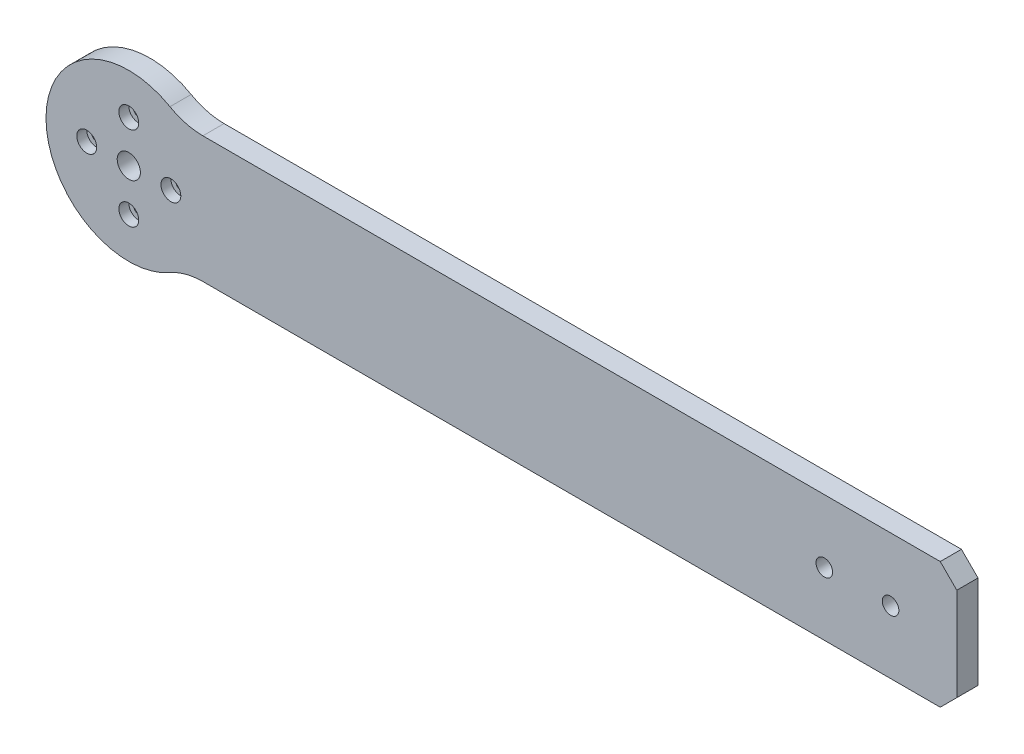
ISO-10303-21;
HEADER;
FILE_DESCRIPTION(('STEP AP214'),'2;1');
FILE_NAME('part.step','',(''),(''),'','','');
FILE_SCHEMA(('AUTOMOTIVE_DESIGN { 1 0 10303 214 1 1 1 1 }'));
ENDSEC;
DATA;
#1=APPLICATION_CONTEXT('core data for automotive mechanical design processes');
#2=APPLICATION_PROTOCOL_DEFINITION('international standard','automotive_design',2000,#1);
#3=PRODUCT_CONTEXT('',#1,'mechanical');
#4=PRODUCT('Part','Part','',(#3));
#5=PRODUCT_RELATED_PRODUCT_CATEGORY('part','',(#4));
#6=PRODUCT_DEFINITION_FORMATION('','',#4);
#7=PRODUCT_DEFINITION_CONTEXT('part definition',#1,'design');
#8=PRODUCT_DEFINITION('design','',#6,#7);
#9=PRODUCT_DEFINITION_SHAPE('','',#8);
#10=(LENGTH_UNIT() NAMED_UNIT(*) SI_UNIT(.MILLI.,.METRE.));
#11=(NAMED_UNIT(*) PLANE_ANGLE_UNIT() SI_UNIT($,.RADIAN.));
#12=(NAMED_UNIT(*) SI_UNIT($,.STERADIAN.) SOLID_ANGLE_UNIT());
#13=UNCERTAINTY_MEASURE_WITH_UNIT(LENGTH_MEASURE(1.E-05),#10,'distance_accuracy_value','');
#14=(GEOMETRIC_REPRESENTATION_CONTEXT(3) GLOBAL_UNCERTAINTY_ASSIGNED_CONTEXT((#13)) GLOBAL_UNIT_ASSIGNED_CONTEXT((#10,
#11,#12)) REPRESENTATION_CONTEXT('',''));
#15=CARTESIAN_POINT('',(0.,0.,0.));
#16=DIRECTION('',(0.,0.,1.));
#17=DIRECTION('',(1.,0.,0.));
#18=AXIS2_PLACEMENT_3D('',#15,#16,#17);
#19=CARTESIAN_POINT('',(0.,12.7,6.4));
#20=DIRECTION('',(0.,0.,-1.));
#21=DIRECTION('',(-1.,0.,0.));
#22=AXIS2_PLACEMENT_3D('',#19,#20,#21);
#23=CYLINDRICAL_SURFACE('',#22,1.5);
#24=CARTESIAN_POINT('',(0.,12.7,0.));
#25=DIRECTION('',(0.,0.,1.));
#26=DIRECTION('',(1.,0.,0.));
#27=AXIS2_PLACEMENT_3D('',#24,#25,#26);
#28=CIRCLE('',#27,1.5);
#29=CARTESIAN_POINT('',(1.5,12.7,0.));
#30=VERTEX_POINT('',#29);
#31=EDGE_CURVE('E362',#30,#30,#28,.T.);
#32=ORIENTED_EDGE('',*,*,#31,.F.);
#33=EDGE_LOOP('',(#32));
#34=FACE_BOUND('',#33,.T.);
#35=CARTESIAN_POINT('',(0.,12.7,3.4));
#36=DIRECTION('',(0.,0.,1.));
#37=DIRECTION('',(1.,0.,0.));
#38=AXIS2_PLACEMENT_3D('',#35,#36,#37);
#39=CIRCLE('',#38,1.5);
#40=CARTESIAN_POINT('',(1.5,12.7,3.4));
#41=VERTEX_POINT('',#40);
#42=EDGE_CURVE('E173',#41,#41,#39,.T.);
#43=ORIENTED_EDGE('',*,*,#42,.T.);
#44=EDGE_LOOP('',(#43));
#45=FACE_BOUND('',#44,.T.);
#46=ADVANCED_FACE('F53',(#34,#45),#23,.F.);
#47=CARTESIAN_POINT('',(12.7,0.,6.4));
#48=DIRECTION('',(0.,0.,-1.));
#49=DIRECTION('',(-1.,0.,0.));
#50=AXIS2_PLACEMENT_3D('',#47,#48,#49);
#51=CYLINDRICAL_SURFACE('',#50,1.5);
#52=CARTESIAN_POINT('',(12.7,0.,0.));
#53=DIRECTION('',(0.,0.,1.));
#54=DIRECTION('',(1.,0.,0.));
#55=AXIS2_PLACEMENT_3D('',#52,#53,#54);
#56=CIRCLE('',#55,1.5);
#57=CARTESIAN_POINT('',(14.2,0.,0.));
#58=VERTEX_POINT('',#57);
#59=EDGE_CURVE('E358',#58,#58,#56,.T.);
#60=ORIENTED_EDGE('',*,*,#59,.F.);
#61=EDGE_LOOP('',(#60));
#62=FACE_BOUND('',#61,.T.);
#63=CARTESIAN_POINT('',(12.7,0.,3.4));
#64=DIRECTION('',(0.,0.,1.));
#65=DIRECTION('',(1.,0.,0.));
#66=AXIS2_PLACEMENT_3D('',#63,#64,#65);
#67=CIRCLE('',#66,1.5);
#68=CARTESIAN_POINT('',(14.2,0.,3.4));
#69=VERTEX_POINT('',#68);
#70=EDGE_CURVE('E169',#69,#69,#67,.T.);
#71=ORIENTED_EDGE('',*,*,#70,.T.);
#72=EDGE_LOOP('',(#71));
#73=FACE_BOUND('',#72,.T.);
#74=ADVANCED_FACE('F233',(#62,#73),#51,.F.);
#75=CARTESIAN_POINT('',(0.,-12.7,6.4));
#76=DIRECTION('',(0.,0.,-1.));
#77=DIRECTION('',(-1.,0.,0.));
#78=AXIS2_PLACEMENT_3D('',#75,#76,#77);
#79=CYLINDRICAL_SURFACE('',#78,1.5);
#80=CARTESIAN_POINT('',(0.,-12.7,0.));
#81=DIRECTION('',(0.,0.,1.));
#82=DIRECTION('',(1.,0.,0.));
#83=AXIS2_PLACEMENT_3D('',#80,#81,#82);
#84=CIRCLE('',#83,1.5);
#85=CARTESIAN_POINT('',(1.49999999999991,-12.7,0.));
#86=VERTEX_POINT('',#85);
#87=EDGE_CURVE('E325',#86,#86,#84,.T.);
#88=ORIENTED_EDGE('',*,*,#87,.F.);
#89=EDGE_LOOP('',(#88));
#90=FACE_BOUND('',#89,.T.);
#91=CARTESIAN_POINT('',(0.,-12.7,3.4));
#92=DIRECTION('',(0.,0.,1.));
#93=DIRECTION('',(1.,0.,0.));
#94=AXIS2_PLACEMENT_3D('',#91,#92,#93);
#95=CIRCLE('',#94,1.5);
#96=CARTESIAN_POINT('',(1.49999999999991,-12.7,3.4));
#97=VERTEX_POINT('',#96);
#98=EDGE_CURVE('E164',#97,#97,#95,.T.);
#99=ORIENTED_EDGE('',*,*,#98,.T.);
#100=EDGE_LOOP('',(#99));
#101=FACE_BOUND('',#100,.T.);
#102=ADVANCED_FACE('F239',(#90,#101),#79,.F.);
#103=CARTESIAN_POINT('',(-12.7,0.,6.4));
#104=DIRECTION('',(0.,0.,-1.));
#105=DIRECTION('',(-1.,0.,0.));
#106=AXIS2_PLACEMENT_3D('',#103,#104,#105);
#107=CYLINDRICAL_SURFACE('',#106,1.49999999999996);
#108=CARTESIAN_POINT('',(-12.7,0.,0.));
#109=DIRECTION('',(0.,0.,1.));
#110=DIRECTION('',(1.,0.,0.));
#111=AXIS2_PLACEMENT_3D('',#108,#109,#110);
#112=CIRCLE('',#111,1.49999999999996);
#113=CARTESIAN_POINT('',(-11.2,0.,0.));
#114=VERTEX_POINT('',#113);
#115=EDGE_CURVE('E176',#114,#114,#112,.T.);
#116=ORIENTED_EDGE('',*,*,#115,.F.);
#117=EDGE_LOOP('',(#116));
#118=FACE_BOUND('',#117,.T.);
#119=CARTESIAN_POINT('',(-12.7,0.,3.4));
#120=DIRECTION('',(0.,0.,1.));
#121=DIRECTION('',(1.,0.,0.));
#122=AXIS2_PLACEMENT_3D('',#119,#120,#121);
#123=CIRCLE('',#122,1.49999999999996);
#124=CARTESIAN_POINT('',(-11.2,0.,3.4));
#125=VERTEX_POINT('',#124);
#126=EDGE_CURVE('E160',#125,#125,#123,.T.);
#127=ORIENTED_EDGE('',*,*,#126,.T.);
#128=EDGE_LOOP('',(#127));
#129=FACE_BOUND('',#128,.T.);
#130=ADVANCED_FACE('F261',(#118,#129),#107,.F.);
#131=CARTESIAN_POINT('',(0.,0.,6.4));
#132=DIRECTION('',(0.,0.,1.));
#133=DIRECTION('',(1.,0.,0.));
#134=AXIS2_PLACEMENT_3D('',#131,#132,#133);
#135=PLANE('',#134);
#136=CARTESIAN_POINT('',(0.,12.7,6.4));
#137=DIRECTION('',(0.,0.,1.));
#138=DIRECTION('',(1.,0.,0.));
#139=AXIS2_PLACEMENT_3D('',#136,#137,#138);
#140=CIRCLE('',#139,3.);
#141=CARTESIAN_POINT('',(3.,12.7,6.4));
#142=VERTEX_POINT('',#141);
#143=EDGE_CURVE('E406',#142,#142,#140,.T.);
#144=ORIENTED_EDGE('',*,*,#143,.F.);
#145=EDGE_LOOP('',(#144));
#146=FACE_BOUND('',#145,.T.);
#147=CARTESIAN_POINT('',(12.7,0.,6.4));
#148=DIRECTION('',(0.,0.,1.));
#149=DIRECTION('',(1.,0.,0.));
#150=AXIS2_PLACEMENT_3D('',#147,#148,#149);
#151=CIRCLE('',#150,3.);
#152=CARTESIAN_POINT('',(15.7,0.,6.4));
#153=VERTEX_POINT('',#152);
#154=EDGE_CURVE('E332',#153,#153,#151,.T.);
#155=ORIENTED_EDGE('',*,*,#154,.F.);
#156=EDGE_LOOP('',(#155));
#157=FACE_BOUND('',#156,.T.);
#158=CARTESIAN_POINT('',(0.,-12.7,6.4));
#159=DIRECTION('',(0.,0.,1.));
#160=DIRECTION('',(1.,0.,0.));
#161=AXIS2_PLACEMENT_3D('',#158,#159,#160);
#162=CIRCLE('',#161,3.);
#163=CARTESIAN_POINT('',(2.99999999999996,-12.7,6.4));
#164=VERTEX_POINT('',#163);
#165=EDGE_CURVE('E333',#164,#164,#162,.T.);
#166=ORIENTED_EDGE('',*,*,#165,.F.);
#167=EDGE_LOOP('',(#166));
#168=FACE_BOUND('',#167,.T.);
#169=CARTESIAN_POINT('',(-12.7,0.,6.4));
#170=DIRECTION('',(0.,0.,1.));
#171=DIRECTION('',(1.,0.,0.));
#172=AXIS2_PLACEMENT_3D('',#169,#170,#171);
#173=CIRCLE('',#172,3.);
#174=CARTESIAN_POINT('',(-9.70000000000004,0.,6.4));
#175=VERTEX_POINT('',#174);
#176=EDGE_CURVE('E350',#175,#175,#173,.T.);
#177=ORIENTED_EDGE('',*,*,#176,.F.);
#178=EDGE_LOOP('',(#177));
#179=FACE_BOUND('',#178,.T.);
#180=CARTESIAN_POINT('',(230.,0.,6.4));
#181=DIRECTION('',(0.,0.,1.));
#182=DIRECTION('',(1.,0.,0.));
#183=AXIS2_PLACEMENT_3D('',#180,#181,#182);
#184=CIRCLE('',#183,2.5);
#185=CARTESIAN_POINT('',(232.5,0.,6.4));
#186=VERTEX_POINT('',#185);
#187=EDGE_CURVE('E374',#186,#186,#184,.T.);
#188=ORIENTED_EDGE('',*,*,#187,.F.);
#189=EDGE_LOOP('',(#188));
#190=FACE_BOUND('',#189,.T.);
#191=DIRECTION('',(1.,0.,0.));
#192=VECTOR('',#191,1.);
#193=CARTESIAN_POINT('',(250.,-19.05,6.4));
#194=LINE('',#193,#192);
#195=CARTESIAN_POINT('',(22.3628598350032,-19.05,6.4));
#196=VERTEX_POINT('',#195);
#197=CARTESIAN_POINT('',(245.,-19.05,6.4));
#198=VERTEX_POINT('',#197);
#199=EDGE_CURVE('E138',#196,#198,#194,.T.);
#200=ORIENTED_EDGE('',*,*,#199,.T.);
#201=DIRECTION('',(-0.707106781186548,-0.707106781186548,0.));
#202=VECTOR('',#201,1.);
#203=CARTESIAN_POINT('',(132.025,-132.025,6.4));
#204=LINE('',#203,#202);
#205=CARTESIAN_POINT('',(250.,-14.05,6.4));
#206=VERTEX_POINT('',#205);
#207=EDGE_CURVE('E62',#198,#206,#204,.F.);
#208=ORIENTED_EDGE('',*,*,#207,.T.);
#209=DIRECTION('',(0.,1.,0.));
#210=VECTOR('',#209,1.);
#211=CARTESIAN_POINT('',(250.,19.05,6.4));
#212=LINE('',#211,#210);
#213=CARTESIAN_POINT('',(250.,14.05,6.4));
#214=VERTEX_POINT('',#213);
#215=EDGE_CURVE('E147',#206,#214,#212,.T.);
#216=ORIENTED_EDGE('',*,*,#215,.T.);
#217=DIRECTION('',(0.707106781186546,-0.707106781186549,0.));
#218=VECTOR('',#217,1.);
#219=CARTESIAN_POINT('',(132.025000000001,132.025,6.4));
#220=LINE('',#219,#218);
#221=CARTESIAN_POINT('',(245.,19.05,6.4));
#222=VERTEX_POINT('',#221);
#223=EDGE_CURVE('E69',#214,#222,#220,.F.);
#224=ORIENTED_EDGE('',*,*,#223,.T.);
#225=DIRECTION('',(-1.,0.,0.));
#226=VECTOR('',#225,1.);
#227=CARTESIAN_POINT('',(250.,19.05,6.4));
#228=LINE('',#227,#226);
#229=CARTESIAN_POINT('',(22.3628598350032,19.05,6.4));
#230=VERTEX_POINT('',#229);
#231=EDGE_CURVE('E153',#222,#230,#228,.T.);
#232=ORIENTED_EDGE('',*,*,#231,.T.);
#233=CARTESIAN_POINT('',(22.3628598350032,39.05,6.4));
#234=DIRECTION('',(0.,0.,1.));
#235=DIRECTION('',(1.,0.,0.));
#236=AXIS2_PLACEMENT_3D('',#233,#234,#235);
#237=CIRCLE('',#236,20.);
#238=CARTESIAN_POINT('',(12.4238110194462,21.6944444444445,6.4));
#239=VERTEX_POINT('',#238);
#240=EDGE_CURVE('E192',#230,#239,#237,.F.);
#241=ORIENTED_EDGE('',*,*,#240,.T.);
#242=CARTESIAN_POINT('',(0.,0.,6.4));
#243=DIRECTION('',(0.,0.,1.));
#244=DIRECTION('',(1.,0.,0.));
#245=AXIS2_PLACEMENT_3D('',#242,#243,#244);
#246=CIRCLE('',#245,25.);
#247=CARTESIAN_POINT('',(12.4238110194462,-21.6944444444445,6.4));
#248=VERTEX_POINT('',#247);
#249=EDGE_CURVE('E391',#239,#248,#246,.T.);
#250=ORIENTED_EDGE('',*,*,#249,.T.);
#251=CARTESIAN_POINT('',(22.3628598350032,-39.05,6.4));
#252=DIRECTION('',(0.,0.,1.));
#253=DIRECTION('',(1.,0.,0.));
#254=AXIS2_PLACEMENT_3D('',#251,#252,#253);
#255=CIRCLE('',#254,20.);
#256=EDGE_CURVE('E133',#248,#196,#255,.F.);
#257=ORIENTED_EDGE('',*,*,#256,.T.);
#258=EDGE_LOOP('',(#200,#208,#216,#224,#232,#241,#250,#257));
#259=FACE_BOUND('',#258,.T.);
#260=CARTESIAN_POINT('',(0.,0.,6.4));
#261=DIRECTION('',(0.,0.,1.));
#262=DIRECTION('',(1.,0.,0.));
#263=AXIS2_PLACEMENT_3D('',#260,#261,#262);
#264=CIRCLE('',#263,3.5);
#265=CARTESIAN_POINT('',(3.5,0.,6.4));
#266=VERTEX_POINT('',#265);
#267=EDGE_CURVE('E382',#266,#266,#264,.T.);
#268=ORIENTED_EDGE('',*,*,#267,.F.);
#269=EDGE_LOOP('',(#268));
#270=FACE_BOUND('',#269,.T.);
#271=CARTESIAN_POINT('',(210.,0.,6.4));
#272=DIRECTION('',(0.,0.,1.));
#273=DIRECTION('',(1.,0.,0.));
#274=AXIS2_PLACEMENT_3D('',#271,#272,#273);
#275=CIRCLE('',#274,2.5);
#276=CARTESIAN_POINT('',(212.5,0.,6.4));
#277=VERTEX_POINT('',#276);
#278=EDGE_CURVE('E366',#277,#277,#275,.T.);
#279=ORIENTED_EDGE('',*,*,#278,.F.);
#280=EDGE_LOOP('',(#279));
#281=FACE_BOUND('',#280,.T.);
#282=ADVANCED_FACE('F214',(#146,#157,#168,#179,#190,#259,#270,#281),#135,.T.);
#283=CARTESIAN_POINT('',(0.,0.,0.));
#284=DIRECTION('',(0.,0.,1.));
#285=DIRECTION('',(1.,0.,0.));
#286=AXIS2_PLACEMENT_3D('',#283,#284,#285);
#287=PLANE('',#286);
#288=DIRECTION('',(0.,1.,0.));
#289=VECTOR('',#288,1.);
#290=CARTESIAN_POINT('',(250.,19.05,0.));
#291=LINE('',#290,#289);
#292=CARTESIAN_POINT('',(250.,-14.05,0.));
#293=VERTEX_POINT('',#292);
#294=CARTESIAN_POINT('',(250.,14.05,0.));
#295=VERTEX_POINT('',#294);
#296=EDGE_CURVE('E386',#293,#295,#291,.T.);
#297=ORIENTED_EDGE('',*,*,#296,.F.);
#298=DIRECTION('',(0.707106781186548,0.707106781186548,0.));
#299=VECTOR('',#298,1.);
#300=CARTESIAN_POINT('',(250.,-14.05,0.));
#301=LINE('',#300,#299);
#302=CARTESIAN_POINT('',(245.,-19.05,0.));
#303=VERTEX_POINT('',#302);
#304=EDGE_CURVE('E145',#293,#303,#301,.F.);
#305=ORIENTED_EDGE('',*,*,#304,.T.);
#306=DIRECTION('',(1.,0.,0.));
#307=VECTOR('',#306,1.);
#308=CARTESIAN_POINT('',(250.,-19.05,0.));
#309=LINE('',#308,#307);
#310=CARTESIAN_POINT('',(22.3628598350032,-19.05,0.));
#311=VERTEX_POINT('',#310);
#312=EDGE_CURVE('E137',#311,#303,#309,.T.);
#313=ORIENTED_EDGE('',*,*,#312,.F.);
#314=CARTESIAN_POINT('',(22.3628598350032,-39.05,0.));
#315=DIRECTION('',(0.,0.,1.));
#316=DIRECTION('',(1.,0.,0.));
#317=AXIS2_PLACEMENT_3D('',#314,#315,#316);
#318=CIRCLE('',#317,20.);
#319=CARTESIAN_POINT('',(12.4238110194462,-21.6944444444445,0.));
#320=VERTEX_POINT('',#319);
#321=EDGE_CURVE('E122',#311,#320,#318,.T.);
#322=ORIENTED_EDGE('',*,*,#321,.T.);
#323=CARTESIAN_POINT('',(0.,0.,0.));
#324=DIRECTION('',(0.,0.,1.));
#325=DIRECTION('',(1.,0.,0.));
#326=AXIS2_PLACEMENT_3D('',#323,#324,#325);
#327=CIRCLE('',#326,25.);
#328=CARTESIAN_POINT('',(12.4238110194462,21.6944444444445,0.));
#329=VERTEX_POINT('',#328);
#330=EDGE_CURVE('E148',#329,#320,#327,.T.);
#331=ORIENTED_EDGE('',*,*,#330,.F.);
#332=CARTESIAN_POINT('',(22.3628598350032,39.05,0.));
#333=DIRECTION('',(0.,0.,1.));
#334=DIRECTION('',(1.,0.,0.));
#335=AXIS2_PLACEMENT_3D('',#332,#333,#334);
#336=CIRCLE('',#335,20.);
#337=CARTESIAN_POINT('',(22.3628598350032,19.05,0.));
#338=VERTEX_POINT('',#337);
#339=EDGE_CURVE('E188',#329,#338,#336,.T.);
#340=ORIENTED_EDGE('',*,*,#339,.T.);
#341=DIRECTION('',(-1.,0.,0.));
#342=VECTOR('',#341,1.);
#343=CARTESIAN_POINT('',(250.,19.05,0.));
#344=LINE('',#343,#342);
#345=CARTESIAN_POINT('',(245.,19.05,0.));
#346=VERTEX_POINT('',#345);
#347=EDGE_CURVE('E156',#346,#338,#344,.T.);
#348=ORIENTED_EDGE('',*,*,#347,.F.);
#349=DIRECTION('',(-0.707106781186546,0.707106781186549,0.));
#350=VECTOR('',#349,1.);
#351=CARTESIAN_POINT('',(245.,19.05,0.));
#352=LINE('',#351,#350);
#353=EDGE_CURVE('E202',#346,#295,#352,.F.);
#354=ORIENTED_EDGE('',*,*,#353,.T.);
#355=EDGE_LOOP('',(#297,#305,#313,#322,#331,#340,#348,#354));
#356=FACE_BOUND('',#355,.T.);
#357=CARTESIAN_POINT('',(0.,0.,0.));
#358=DIRECTION('',(0.,0.,1.));
#359=DIRECTION('',(1.,0.,0.));
#360=AXIS2_PLACEMENT_3D('',#357,#358,#359);
#361=CIRCLE('',#360,3.5);
#362=CARTESIAN_POINT('',(3.5,0.,0.));
#363=VERTEX_POINT('',#362);
#364=EDGE_CURVE('E378',#363,#363,#361,.T.);
#365=ORIENTED_EDGE('',*,*,#364,.T.);
#366=EDGE_LOOP('',(#365));
#367=FACE_BOUND('',#366,.T.);
#368=CARTESIAN_POINT('',(230.,0.,0.));
#369=DIRECTION('',(0.,0.,1.));
#370=DIRECTION('',(1.,0.,0.));
#371=AXIS2_PLACEMENT_3D('',#368,#369,#370);
#372=CIRCLE('',#371,2.5);
#373=CARTESIAN_POINT('',(232.5,0.,0.));
#374=VERTEX_POINT('',#373);
#375=EDGE_CURVE('E370',#374,#374,#372,.T.);
#376=ORIENTED_EDGE('',*,*,#375,.T.);
#377=EDGE_LOOP('',(#376));
#378=FACE_BOUND('',#377,.T.);
#379=CARTESIAN_POINT('',(210.,0.,0.));
#380=DIRECTION('',(0.,0.,1.));
#381=DIRECTION('',(1.,0.,0.));
#382=AXIS2_PLACEMENT_3D('',#379,#380,#381);
#383=CIRCLE('',#382,2.5);
#384=CARTESIAN_POINT('',(212.5,0.,0.));
#385=VERTEX_POINT('',#384);
#386=EDGE_CURVE('E365',#385,#385,#383,.T.);
#387=ORIENTED_EDGE('',*,*,#386,.T.);
#388=EDGE_LOOP('',(#387));
#389=FACE_BOUND('',#388,.T.);
#390=ORIENTED_EDGE('',*,*,#31,.T.);
#391=EDGE_LOOP('',(#390));
#392=FACE_BOUND('',#391,.T.);
#393=ORIENTED_EDGE('',*,*,#59,.T.);
#394=EDGE_LOOP('',(#393));
#395=FACE_BOUND('',#394,.T.);
#396=ORIENTED_EDGE('',*,*,#87,.T.);
#397=EDGE_LOOP('',(#396));
#398=FACE_BOUND('',#397,.T.);
#399=ORIENTED_EDGE('',*,*,#115,.T.);
#400=EDGE_LOOP('',(#399));
#401=FACE_BOUND('',#400,.T.);
#402=ADVANCED_FACE('F143',(#356,#367,#378,#389,#392,#395,#398,#401),#287,.F.);
#403=CARTESIAN_POINT('',(250.,19.05,6.4));
#404=DIRECTION('',(-1.,0.,0.));
#405=DIRECTION('',(0.,0.,1.));
#406=AXIS2_PLACEMENT_3D('',#403,#404,#405);
#407=PLANE('',#406);
#408=ORIENTED_EDGE('',*,*,#215,.F.);
#409=DIRECTION('',(0.,0.,-1.));
#410=VECTOR('',#409,1.);
#411=CARTESIAN_POINT('',(250.,-14.05,6.4));
#412=LINE('',#411,#410);
#413=EDGE_CURVE('E198',#206,#293,#412,.T.);
#414=ORIENTED_EDGE('',*,*,#413,.T.);
#415=ORIENTED_EDGE('',*,*,#296,.T.);
#416=DIRECTION('',(0.,0.,1.));
#417=VECTOR('',#416,1.);
#418=CARTESIAN_POINT('',(250.,14.05,6.4));
#419=LINE('',#418,#417);
#420=EDGE_CURVE('E195',#295,#214,#419,.T.);
#421=ORIENTED_EDGE('',*,*,#420,.T.);
#422=EDGE_LOOP('',(#408,#414,#415,#421));
#423=FACE_BOUND('',#422,.T.);
#424=ADVANCED_FACE('F219',(#423),#407,.F.);
#425=CARTESIAN_POINT('',(250.,19.05,6.4));
#426=DIRECTION('',(0.,-1.,0.));
#427=DIRECTION('',(1.,0.,0.));
#428=AXIS2_PLACEMENT_3D('',#425,#426,#427);
#429=PLANE('',#428);
#430=ORIENTED_EDGE('',*,*,#231,.F.);
#431=DIRECTION('',(0.,0.,-1.));
#432=VECTOR('',#431,1.);
#433=CARTESIAN_POINT('',(245.,19.05,6.4));
#434=LINE('',#433,#432);
#435=EDGE_CURVE('E13',#222,#346,#434,.T.);
#436=ORIENTED_EDGE('',*,*,#435,.T.);
#437=ORIENTED_EDGE('',*,*,#347,.T.);
#438=DIRECTION('',(0.,0.,1.));
#439=VECTOR('',#438,1.);
#440=CARTESIAN_POINT('',(22.3628598350032,19.05,6.4));
#441=LINE('',#440,#439);
#442=EDGE_CURVE('E134',#338,#230,#441,.T.);
#443=ORIENTED_EDGE('',*,*,#442,.T.);
#444=EDGE_LOOP('',(#430,#436,#437,#443));
#445=FACE_BOUND('',#444,.T.);
#446=ADVANCED_FACE('F270',(#445),#429,.F.);
#447=CARTESIAN_POINT('',(0.,0.,6.4));
#448=DIRECTION('',(0.,0.,-1.));
#449=DIRECTION('',(-1.,0.,0.));
#450=AXIS2_PLACEMENT_3D('',#447,#448,#449);
#451=CYLINDRICAL_SURFACE('',#450,25.);
#452=ORIENTED_EDGE('',*,*,#330,.T.);
#453=DIRECTION('',(0.,0.,-1.));
#454=VECTOR('',#453,1.);
#455=CARTESIAN_POINT('',(12.4238110194462,-21.6944444444445,6.4));
#456=LINE('',#455,#454);
#457=EDGE_CURVE('E127',#320,#248,#456,.F.);
#458=ORIENTED_EDGE('',*,*,#457,.T.);
#459=ORIENTED_EDGE('',*,*,#249,.F.);
#460=DIRECTION('',(0.,0.,-1.));
#461=VECTOR('',#460,1.);
#462=CARTESIAN_POINT('',(12.4238110194462,21.6944444444445,6.4));
#463=LINE('',#462,#461);
#464=EDGE_CURVE('E140',#239,#329,#463,.T.);
#465=ORIENTED_EDGE('',*,*,#464,.T.);
#466=EDGE_LOOP('',(#452,#458,#459,#465));
#467=FACE_BOUND('',#466,.T.);
#468=ADVANCED_FACE('F267',(#467),#451,.T.);
#469=CARTESIAN_POINT('',(250.,-19.05,6.4));
#470=DIRECTION('',(0.,1.,0.));
#471=DIRECTION('',(-1.,0.,0.));
#472=AXIS2_PLACEMENT_3D('',#469,#470,#471);
#473=PLANE('',#472);
#474=ORIENTED_EDGE('',*,*,#312,.T.);
#475=DIRECTION('',(0.,0.,1.));
#476=VECTOR('',#475,1.);
#477=CARTESIAN_POINT('',(245.,-19.05,6.4));
#478=LINE('',#477,#476);
#479=EDGE_CURVE('E77',#303,#198,#478,.T.);
#480=ORIENTED_EDGE('',*,*,#479,.T.);
#481=ORIENTED_EDGE('',*,*,#199,.F.);
#482=DIRECTION('',(0.,0.,1.));
#483=VECTOR('',#482,1.);
#484=CARTESIAN_POINT('',(22.3628598350032,-19.05,0.));
#485=LINE('',#484,#483);
#486=EDGE_CURVE('E126',#196,#311,#485,.F.);
#487=ORIENTED_EDGE('',*,*,#486,.T.);
#488=EDGE_LOOP('',(#474,#480,#481,#487));
#489=FACE_BOUND('',#488,.T.);
#490=ADVANCED_FACE('F136',(#489),#473,.F.);
#491=CARTESIAN_POINT('',(0.,0.,6.4));
#492=DIRECTION('',(0.,0.,-1.));
#493=DIRECTION('',(-1.,0.,0.));
#494=AXIS2_PLACEMENT_3D('',#491,#492,#493);
#495=CYLINDRICAL_SURFACE('',#494,3.5);
#496=ORIENTED_EDGE('',*,*,#267,.T.);
#497=EDGE_LOOP('',(#496));
#498=FACE_BOUND('',#497,.T.);
#499=ORIENTED_EDGE('',*,*,#364,.F.);
#500=EDGE_LOOP('',(#499));
#501=FACE_BOUND('',#500,.T.);
#502=ADVANCED_FACE('F254',(#498,#501),#495,.F.);
#503=CARTESIAN_POINT('',(230.,0.,6.4));
#504=DIRECTION('',(0.,0.,-1.));
#505=DIRECTION('',(-1.,0.,0.));
#506=AXIS2_PLACEMENT_3D('',#503,#504,#505);
#507=CYLINDRICAL_SURFACE('',#506,2.5);
#508=ORIENTED_EDGE('',*,*,#187,.T.);
#509=EDGE_LOOP('',(#508));
#510=FACE_BOUND('',#509,.T.);
#511=ORIENTED_EDGE('',*,*,#375,.F.);
#512=EDGE_LOOP('',(#511));
#513=FACE_BOUND('',#512,.T.);
#514=ADVANCED_FACE('F250',(#510,#513),#507,.F.);
#515=CARTESIAN_POINT('',(210.,0.,6.4));
#516=DIRECTION('',(0.,0.,-1.));
#517=DIRECTION('',(-1.,0.,0.));
#518=AXIS2_PLACEMENT_3D('',#515,#516,#517);
#519=CYLINDRICAL_SURFACE('',#518,2.5);
#520=ORIENTED_EDGE('',*,*,#278,.T.);
#521=EDGE_LOOP('',(#520));
#522=FACE_BOUND('',#521,.T.);
#523=ORIENTED_EDGE('',*,*,#386,.F.);
#524=EDGE_LOOP('',(#523));
#525=FACE_BOUND('',#524,.T.);
#526=ADVANCED_FACE('F246',(#522,#525),#519,.F.);
#527=CARTESIAN_POINT('',(-12.7,0.,3.4));
#528=DIRECTION('',(0.,0.,1.));
#529=DIRECTION('',(1.,0.,0.));
#530=AXIS2_PLACEMENT_3D('',#527,#528,#529);
#531=CYLINDRICAL_SURFACE('',#530,3.);
#532=CARTESIAN_POINT('',(-12.7,0.,3.4));
#533=DIRECTION('',(0.,0.,1.));
#534=DIRECTION('',(1.,0.,0.));
#535=AXIS2_PLACEMENT_3D('',#532,#533,#534);
#536=CIRCLE('',#535,3.);
#537=CARTESIAN_POINT('',(-9.70000000000004,0.,3.4));
#538=VERTEX_POINT('',#537);
#539=EDGE_CURVE('E343',#538,#538,#536,.T.);
#540=ORIENTED_EDGE('',*,*,#539,.F.);
#541=EDGE_LOOP('',(#540));
#542=FACE_BOUND('',#541,.T.);
#543=ORIENTED_EDGE('',*,*,#176,.T.);
#544=EDGE_LOOP('',(#543));
#545=FACE_BOUND('',#544,.T.);
#546=ADVANCED_FACE('F249',(#542,#545),#531,.F.);
#547=CARTESIAN_POINT('',(-12.7,0.,3.4));
#548=DIRECTION('',(0.,0.,1.));
#549=DIRECTION('',(1.,0.,0.));
#550=AXIS2_PLACEMENT_3D('',#547,#548,#549);
#551=PLANE('',#550);
#552=ORIENTED_EDGE('',*,*,#126,.F.);
#553=EDGE_LOOP('',(#552));
#554=FACE_BOUND('',#553,.T.);
#555=ORIENTED_EDGE('',*,*,#539,.T.);
#556=EDGE_LOOP('',(#555));
#557=FACE_BOUND('',#556,.T.);
#558=ADVANCED_FACE('F308',(#554,#557),#551,.T.);
#559=CARTESIAN_POINT('',(0.,-12.7,3.4));
#560=DIRECTION('',(0.,0.,1.));
#561=DIRECTION('',(1.,0.,0.));
#562=AXIS2_PLACEMENT_3D('',#559,#560,#561);
#563=CYLINDRICAL_SURFACE('',#562,3.);
#564=CARTESIAN_POINT('',(0.,-12.7,3.4));
#565=DIRECTION('',(0.,0.,1.));
#566=DIRECTION('',(1.,0.,0.));
#567=AXIS2_PLACEMENT_3D('',#564,#565,#566);
#568=CIRCLE('',#567,3.);
#569=CARTESIAN_POINT('',(2.99999999999996,-12.7,3.4));
#570=VERTEX_POINT('',#569);
#571=EDGE_CURVE('E330',#570,#570,#568,.T.);
#572=ORIENTED_EDGE('',*,*,#571,.F.);
#573=EDGE_LOOP('',(#572));
#574=FACE_BOUND('',#573,.T.);
#575=ORIENTED_EDGE('',*,*,#165,.T.);
#576=EDGE_LOOP('',(#575));
#577=FACE_BOUND('',#576,.T.);
#578=ADVANCED_FACE('F304',(#574,#577),#563,.F.);
#579=CARTESIAN_POINT('',(0.,-12.7,3.4));
#580=DIRECTION('',(0.,0.,1.));
#581=DIRECTION('',(1.,0.,0.));
#582=AXIS2_PLACEMENT_3D('',#579,#580,#581);
#583=PLANE('',#582);
#584=ORIENTED_EDGE('',*,*,#98,.F.);
#585=EDGE_LOOP('',(#584));
#586=FACE_BOUND('',#585,.T.);
#587=ORIENTED_EDGE('',*,*,#571,.T.);
#588=EDGE_LOOP('',(#587));
#589=FACE_BOUND('',#588,.T.);
#590=ADVANCED_FACE('F300',(#586,#589),#583,.T.);
#591=CARTESIAN_POINT('',(12.7,0.,3.4));
#592=DIRECTION('',(0.,0.,1.));
#593=DIRECTION('',(1.,0.,0.));
#594=AXIS2_PLACEMENT_3D('',#591,#592,#593);
#595=CYLINDRICAL_SURFACE('',#594,3.);
#596=CARTESIAN_POINT('',(12.7,0.,3.4));
#597=DIRECTION('',(0.,0.,1.));
#598=DIRECTION('',(1.,0.,0.));
#599=AXIS2_PLACEMENT_3D('',#596,#597,#598);
#600=CIRCLE('',#599,3.);
#601=CARTESIAN_POINT('',(15.7,0.,3.4));
#602=VERTEX_POINT('',#601);
#603=EDGE_CURVE('E339',#602,#602,#600,.T.);
#604=ORIENTED_EDGE('',*,*,#603,.F.);
#605=EDGE_LOOP('',(#604));
#606=FACE_BOUND('',#605,.T.);
#607=ORIENTED_EDGE('',*,*,#154,.T.);
#608=EDGE_LOOP('',(#607));
#609=FACE_BOUND('',#608,.T.);
#610=ADVANCED_FACE('F296',(#606,#609),#595,.F.);
#611=CARTESIAN_POINT('',(12.7,0.,3.4));
#612=DIRECTION('',(0.,0.,1.));
#613=DIRECTION('',(1.,0.,0.));
#614=AXIS2_PLACEMENT_3D('',#611,#612,#613);
#615=PLANE('',#614);
#616=ORIENTED_EDGE('',*,*,#70,.F.);
#617=EDGE_LOOP('',(#616));
#618=FACE_BOUND('',#617,.T.);
#619=ORIENTED_EDGE('',*,*,#603,.T.);
#620=EDGE_LOOP('',(#619));
#621=FACE_BOUND('',#620,.T.);
#622=ADVANCED_FACE('F288',(#618,#621),#615,.T.);
#623=CARTESIAN_POINT('',(0.,12.7,3.4));
#624=DIRECTION('',(0.,0.,1.));
#625=DIRECTION('',(1.,0.,0.));
#626=AXIS2_PLACEMENT_3D('',#623,#624,#625);
#627=CYLINDRICAL_SURFACE('',#626,3.);
#628=CARTESIAN_POINT('',(0.,12.7,3.4));
#629=DIRECTION('',(0.,0.,1.));
#630=DIRECTION('',(1.,0.,0.));
#631=AXIS2_PLACEMENT_3D('',#628,#629,#630);
#632=CIRCLE('',#631,3.);
#633=CARTESIAN_POINT('',(3.,12.7,3.4));
#634=VERTEX_POINT('',#633);
#635=EDGE_CURVE('E165',#634,#634,#632,.T.);
#636=ORIENTED_EDGE('',*,*,#635,.F.);
#637=EDGE_LOOP('',(#636));
#638=FACE_BOUND('',#637,.T.);
#639=ORIENTED_EDGE('',*,*,#143,.T.);
#640=EDGE_LOOP('',(#639));
#641=FACE_BOUND('',#640,.T.);
#642=ADVANCED_FACE('F282',(#638,#641),#627,.F.);
#643=CARTESIAN_POINT('',(0.,12.7,3.4));
#644=DIRECTION('',(0.,0.,1.));
#645=DIRECTION('',(1.,0.,0.));
#646=AXIS2_PLACEMENT_3D('',#643,#644,#645);
#647=PLANE('',#646);
#648=ORIENTED_EDGE('',*,*,#42,.F.);
#649=EDGE_LOOP('',(#648));
#650=FACE_BOUND('',#649,.T.);
#651=ORIENTED_EDGE('',*,*,#635,.T.);
#652=EDGE_LOOP('',(#651));
#653=FACE_BOUND('',#652,.T.);
#654=ADVANCED_FACE('F278',(#650,#653),#647,.T.);
#655=CARTESIAN_POINT('',(22.3628598350032,-39.05,6.4));
#656=DIRECTION('',(0.,0.,-1.));
#657=DIRECTION('',(-1.,0.,0.));
#658=AXIS2_PLACEMENT_3D('',#655,#656,#657);
#659=CYLINDRICAL_SURFACE('',#658,20.);
#660=ORIENTED_EDGE('',*,*,#256,.F.);
#661=ORIENTED_EDGE('',*,*,#457,.F.);
#662=ORIENTED_EDGE('',*,*,#321,.F.);
#663=ORIENTED_EDGE('',*,*,#486,.F.);
#664=EDGE_LOOP('',(#660,#661,#662,#663));
#665=FACE_BOUND('',#664,.T.);
#666=ADVANCED_FACE('F125',(#665),#659,.F.);
#667=CARTESIAN_POINT('',(22.3628598350032,39.05,6.4));
#668=DIRECTION('',(0.,0.,-1.));
#669=DIRECTION('',(-1.,0.,0.));
#670=AXIS2_PLACEMENT_3D('',#667,#668,#669);
#671=CYLINDRICAL_SURFACE('',#670,20.);
#672=ORIENTED_EDGE('',*,*,#240,.F.);
#673=ORIENTED_EDGE('',*,*,#442,.F.);
#674=ORIENTED_EDGE('',*,*,#339,.F.);
#675=ORIENTED_EDGE('',*,*,#464,.F.);
#676=EDGE_LOOP('',(#672,#673,#674,#675));
#677=FACE_BOUND('',#676,.T.);
#678=ADVANCED_FACE('F224',(#677),#671,.F.);
#679=CARTESIAN_POINT('',(250.,-14.05,6.4));
#680=DIRECTION('',(-0.707106781186547,0.707106781186547,0.));
#681=DIRECTION('',(0.,0.,-1.));
#682=AXIS2_PLACEMENT_3D('',#679,#680,#681);
#683=PLANE('',#682);
#684=ORIENTED_EDGE('',*,*,#207,.F.);
#685=ORIENTED_EDGE('',*,*,#479,.F.);
#686=ORIENTED_EDGE('',*,*,#304,.F.);
#687=ORIENTED_EDGE('',*,*,#413,.F.);
#688=EDGE_LOOP('',(#684,#685,#686,#687));
#689=FACE_BOUND('',#688,.T.);
#690=ADVANCED_FACE('F222',(#689),#683,.F.);
#691=CARTESIAN_POINT('',(245.,19.05,6.4));
#692=DIRECTION('',(-0.707106781186549,-0.707106781186546,0.));
#693=DIRECTION('',(0.,0.,-1.));
#694=AXIS2_PLACEMENT_3D('',#691,#692,#693);
#695=PLANE('',#694);
#696=ORIENTED_EDGE('',*,*,#223,.F.);
#697=ORIENTED_EDGE('',*,*,#420,.F.);
#698=ORIENTED_EDGE('',*,*,#353,.F.);
#699=ORIENTED_EDGE('',*,*,#435,.F.);
#700=EDGE_LOOP('',(#696,#697,#698,#699));
#701=FACE_BOUND('',#700,.T.);
#702=ADVANCED_FACE('F55',(#701),#695,.F.);
#703=CLOSED_SHELL('',(#46,#74,#102,#130,#282,#402,#424,#446,#468,#490,#502,#514,#526,#546,#558,
#578,#590,#610,#622,#642,#654,#666,#678,#690,#702));
#704=MANIFOLD_SOLID_BREP('B2',#703);
#705=ADVANCED_BREP_SHAPE_REPRESENTATION('',(#18,#704),#14);
#706=SHAPE_DEFINITION_REPRESENTATION(#9,#705);
ENDSEC;
END-ISO-10303-21;
